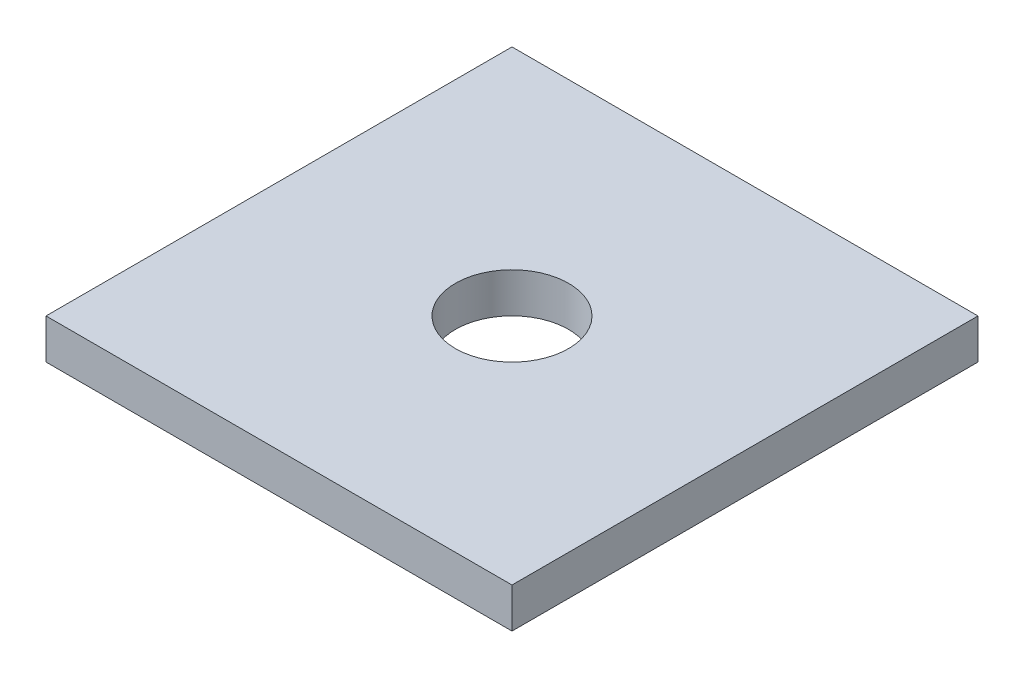
ISO-10303-21;
HEADER;
FILE_DESCRIPTION(('STEP AP214'),'2;1');
FILE_NAME('part.step','',(''),(''),'','','');
FILE_SCHEMA(('AUTOMOTIVE_DESIGN { 1 0 10303 214 1 1 1 1 }'));
ENDSEC;
DATA;
#1=APPLICATION_CONTEXT('core data for automotive mechanical design processes');
#2=APPLICATION_PROTOCOL_DEFINITION('international standard','automotive_design',2000,#1);
#3=PRODUCT_CONTEXT('',#1,'mechanical');
#4=PRODUCT('Part','Part','',(#3));
#5=PRODUCT_RELATED_PRODUCT_CATEGORY('part','',(#4));
#6=PRODUCT_DEFINITION_FORMATION('','',#4);
#7=PRODUCT_DEFINITION_CONTEXT('part definition',#1,'design');
#8=PRODUCT_DEFINITION('design','',#6,#7);
#9=PRODUCT_DEFINITION_SHAPE('','',#8);
#10=(LENGTH_UNIT() NAMED_UNIT(*) SI_UNIT(.MILLI.,.METRE.));
#11=(NAMED_UNIT(*) PLANE_ANGLE_UNIT() SI_UNIT($,.RADIAN.));
#12=(NAMED_UNIT(*) SI_UNIT($,.STERADIAN.) SOLID_ANGLE_UNIT());
#13=UNCERTAINTY_MEASURE_WITH_UNIT(LENGTH_MEASURE(1.E-05),#10,'distance_accuracy_value','');
#14=(GEOMETRIC_REPRESENTATION_CONTEXT(3) GLOBAL_UNCERTAINTY_ASSIGNED_CONTEXT((#13)) GLOBAL_UNIT_ASSIGNED_CONTEXT((#10,
#11,#12)) REPRESENTATION_CONTEXT('',''));
#15=CARTESIAN_POINT('',(0.,0.,0.));
#16=DIRECTION('',(0.,0.,1.));
#17=DIRECTION('',(1.,0.,0.));
#18=AXIS2_PLACEMENT_3D('',#15,#16,#17);
#19=CARTESIAN_POINT('',(35.,-6.,-35.));
#20=DIRECTION('',(1.,0.,0.));
#21=DIRECTION('',(0.,0.,-1.));
#22=AXIS2_PLACEMENT_3D('',#19,#20,#21);
#23=PLANE('',#22);
#24=DIRECTION('',(0.,0.,-1.));
#25=VECTOR('',#24,1.);
#26=CARTESIAN_POINT('',(35.,0.,-35.));
#27=LINE('',#26,#25);
#28=CARTESIAN_POINT('',(35.,0.,35.));
#29=VERTEX_POINT('',#28);
#30=CARTESIAN_POINT('',(35.,0.,-35.));
#31=VERTEX_POINT('',#30);
#32=EDGE_CURVE('E116',#29,#31,#27,.T.);
#33=ORIENTED_EDGE('',*,*,#32,.F.);
#34=DIRECTION('',(0.,1.,0.));
#35=VECTOR('',#34,1.);
#36=CARTESIAN_POINT('',(35.,-6.,35.));
#37=LINE('',#36,#35);
#38=CARTESIAN_POINT('',(35.,-6.,35.));
#39=VERTEX_POINT('',#38);
#40=EDGE_CURVE('E11',#39,#29,#37,.T.);
#41=ORIENTED_EDGE('',*,*,#40,.F.);
#42=DIRECTION('',(0.,0.,-1.));
#43=VECTOR('',#42,1.);
#44=CARTESIAN_POINT('',(35.,-6.,-35.));
#45=LINE('',#44,#43);
#46=CARTESIAN_POINT('',(35.,-6.,-35.));
#47=VERTEX_POINT('',#46);
#48=EDGE_CURVE('E106',#39,#47,#45,.T.);
#49=ORIENTED_EDGE('',*,*,#48,.T.);
#50=DIRECTION('',(0.,1.,0.));
#51=VECTOR('',#50,1.);
#52=CARTESIAN_POINT('',(35.,-6.,-35.));
#53=LINE('',#52,#51);
#54=EDGE_CURVE('E47',#47,#31,#53,.T.);
#55=ORIENTED_EDGE('',*,*,#54,.T.);
#56=EDGE_LOOP('',(#33,#41,#49,#55));
#57=FACE_BOUND('',#56,.T.);
#58=ADVANCED_FACE('F44',(#57),#23,.T.);
#59=CARTESIAN_POINT('',(-35.,-6.,35.));
#60=DIRECTION('',(0.,0.,1.));
#61=DIRECTION('',(1.,0.,0.));
#62=AXIS2_PLACEMENT_3D('',#59,#60,#61);
#63=PLANE('',#62);
#64=DIRECTION('',(1.,0.,0.));
#65=VECTOR('',#64,1.);
#66=CARTESIAN_POINT('',(-35.,0.,35.));
#67=LINE('',#66,#65);
#68=CARTESIAN_POINT('',(-35.,0.,35.));
#69=VERTEX_POINT('',#68);
#70=EDGE_CURVE('E110',#69,#29,#67,.T.);
#71=ORIENTED_EDGE('',*,*,#70,.F.);
#72=DIRECTION('',(0.,1.,0.));
#73=VECTOR('',#72,1.);
#74=CARTESIAN_POINT('',(-35.,-6.,35.));
#75=LINE('',#74,#73);
#76=CARTESIAN_POINT('',(-35.,-6.,35.));
#77=VERTEX_POINT('',#76);
#78=EDGE_CURVE('E54',#77,#69,#75,.T.);
#79=ORIENTED_EDGE('',*,*,#78,.F.);
#80=DIRECTION('',(1.,0.,0.));
#81=VECTOR('',#80,1.);
#82=CARTESIAN_POINT('',(-35.,-6.,35.));
#83=LINE('',#82,#81);
#84=EDGE_CURVE('E101',#77,#39,#83,.T.);
#85=ORIENTED_EDGE('',*,*,#84,.T.);
#86=ORIENTED_EDGE('',*,*,#40,.T.);
#87=EDGE_LOOP('',(#71,#79,#85,#86));
#88=FACE_BOUND('',#87,.T.);
#89=ADVANCED_FACE('F139',(#88),#63,.T.);
#90=CARTESIAN_POINT('',(-35.,-6.,-35.));
#91=DIRECTION('',(-1.,0.,0.));
#92=DIRECTION('',(0.,0.,1.));
#93=AXIS2_PLACEMENT_3D('',#90,#91,#92);
#94=PLANE('',#93);
#95=DIRECTION('',(0.,0.,1.));
#96=VECTOR('',#95,1.);
#97=CARTESIAN_POINT('',(-35.,0.,-35.));
#98=LINE('',#97,#96);
#99=CARTESIAN_POINT('',(-35.,0.,-35.));
#100=VERTEX_POINT('',#99);
#101=EDGE_CURVE('E95',#100,#69,#98,.T.);
#102=ORIENTED_EDGE('',*,*,#101,.F.);
#103=DIRECTION('',(0.,1.,0.));
#104=VECTOR('',#103,1.);
#105=CARTESIAN_POINT('',(-35.,-6.,-35.));
#106=LINE('',#105,#104);
#107=CARTESIAN_POINT('',(-35.,-6.,-35.));
#108=VERTEX_POINT('',#107);
#109=EDGE_CURVE('E90',#108,#100,#106,.T.);
#110=ORIENTED_EDGE('',*,*,#109,.F.);
#111=DIRECTION('',(0.,0.,1.));
#112=VECTOR('',#111,1.);
#113=CARTESIAN_POINT('',(-35.,-6.,-35.));
#114=LINE('',#113,#112);
#115=EDGE_CURVE('E93',#108,#77,#114,.T.);
#116=ORIENTED_EDGE('',*,*,#115,.T.);
#117=ORIENTED_EDGE('',*,*,#78,.T.);
#118=EDGE_LOOP('',(#102,#110,#116,#117));
#119=FACE_BOUND('',#118,.T.);
#120=ADVANCED_FACE('F92',(#119),#94,.T.);
#121=CARTESIAN_POINT('',(-35.,-6.,-35.));
#122=DIRECTION('',(0.,0.,-1.));
#123=DIRECTION('',(-1.,0.,0.));
#124=AXIS2_PLACEMENT_3D('',#121,#122,#123);
#125=PLANE('',#124);
#126=DIRECTION('',(-1.,0.,0.));
#127=VECTOR('',#126,1.);
#128=CARTESIAN_POINT('',(-35.,0.,-35.));
#129=LINE('',#128,#127);
#130=EDGE_CURVE('E120',#31,#100,#129,.T.);
#131=ORIENTED_EDGE('',*,*,#130,.F.);
#132=ORIENTED_EDGE('',*,*,#54,.F.);
#133=DIRECTION('',(-1.,0.,0.));
#134=VECTOR('',#133,1.);
#135=CARTESIAN_POINT('',(-35.,-6.,-35.));
#136=LINE('',#135,#134);
#137=EDGE_CURVE('E100',#47,#108,#136,.T.);
#138=ORIENTED_EDGE('',*,*,#137,.T.);
#139=ORIENTED_EDGE('',*,*,#109,.T.);
#140=EDGE_LOOP('',(#131,#132,#138,#139));
#141=FACE_BOUND('',#140,.T.);
#142=ADVANCED_FACE('F104',(#141),#125,.T.);
#143=CARTESIAN_POINT('',(0.,-6.,0.));
#144=DIRECTION('',(0.,1.,0.));
#145=DIRECTION('',(0.,0.,1.));
#146=AXIS2_PLACEMENT_3D('',#143,#144,#145);
#147=PLANE('',#146);
#148=CARTESIAN_POINT('',(0.,-6.,0.));
#149=DIRECTION('',(0.,1.,0.));
#150=DIRECTION('',(0.,0.,1.));
#151=AXIS2_PLACEMENT_3D('',#148,#149,#150);
#152=CIRCLE('',#151,8.5);
#153=CARTESIAN_POINT('',(0.,-6.,8.50000000000006));
#154=VERTEX_POINT('',#153);
#155=EDGE_CURVE('E121',#154,#154,#152,.T.);
#156=ORIENTED_EDGE('',*,*,#155,.T.);
#157=EDGE_LOOP('',(#156));
#158=FACE_BOUND('',#157,.T.);
#159=ORIENTED_EDGE('',*,*,#48,.F.);
#160=ORIENTED_EDGE('',*,*,#84,.F.);
#161=ORIENTED_EDGE('',*,*,#115,.F.);
#162=ORIENTED_EDGE('',*,*,#137,.F.);
#163=EDGE_LOOP('',(#159,#160,#161,#162));
#164=FACE_BOUND('',#163,.T.);
#165=ADVANCED_FACE('F99',(#158,#164),#147,.F.);
#166=CARTESIAN_POINT('',(0.,0.,0.));
#167=DIRECTION('',(0.,1.,0.));
#168=DIRECTION('',(0.,0.,1.));
#169=AXIS2_PLACEMENT_3D('',#166,#167,#168);
#170=PLANE('',#169);
#171=CARTESIAN_POINT('',(0.,0.,0.));
#172=DIRECTION('',(0.,1.,0.));
#173=DIRECTION('',(0.,0.,1.));
#174=AXIS2_PLACEMENT_3D('',#171,#172,#173);
#175=CIRCLE('',#174,8.5);
#176=CARTESIAN_POINT('',(0.,0.,8.50000000000006));
#177=VERTEX_POINT('',#176);
#178=EDGE_CURVE('E169',#177,#177,#175,.T.);
#179=ORIENTED_EDGE('',*,*,#178,.F.);
#180=EDGE_LOOP('',(#179));
#181=FACE_BOUND('',#180,.T.);
#182=ORIENTED_EDGE('',*,*,#32,.T.);
#183=ORIENTED_EDGE('',*,*,#130,.T.);
#184=ORIENTED_EDGE('',*,*,#101,.T.);
#185=ORIENTED_EDGE('',*,*,#70,.T.);
#186=EDGE_LOOP('',(#182,#183,#184,#185));
#187=FACE_BOUND('',#186,.T.);
#188=ADVANCED_FACE('F138',(#181,#187),#170,.T.);
#189=CARTESIAN_POINT('',(0.,-6.,0.));
#190=DIRECTION('',(0.,1.,0.));
#191=DIRECTION('',(0.,0.,1.));
#192=AXIS2_PLACEMENT_3D('',#189,#190,#191);
#193=CYLINDRICAL_SURFACE('',#192,8.5);
#194=ORIENTED_EDGE('',*,*,#155,.F.);
#195=EDGE_LOOP('',(#194));
#196=FACE_BOUND('',#195,.T.);
#197=ORIENTED_EDGE('',*,*,#178,.T.);
#198=EDGE_LOOP('',(#197));
#199=FACE_BOUND('',#198,.T.);
#200=ADVANCED_FACE('F157',(#196,#199),#193,.F.);
#201=CLOSED_SHELL('',(#58,#89,#120,#142,#165,#188,#200));
#202=MANIFOLD_SOLID_BREP('B2',#201);
#203=ADVANCED_BREP_SHAPE_REPRESENTATION('',(#18,#202),#14);
#204=SHAPE_DEFINITION_REPRESENTATION(#9,#203);
ENDSEC;
END-ISO-10303-21;
